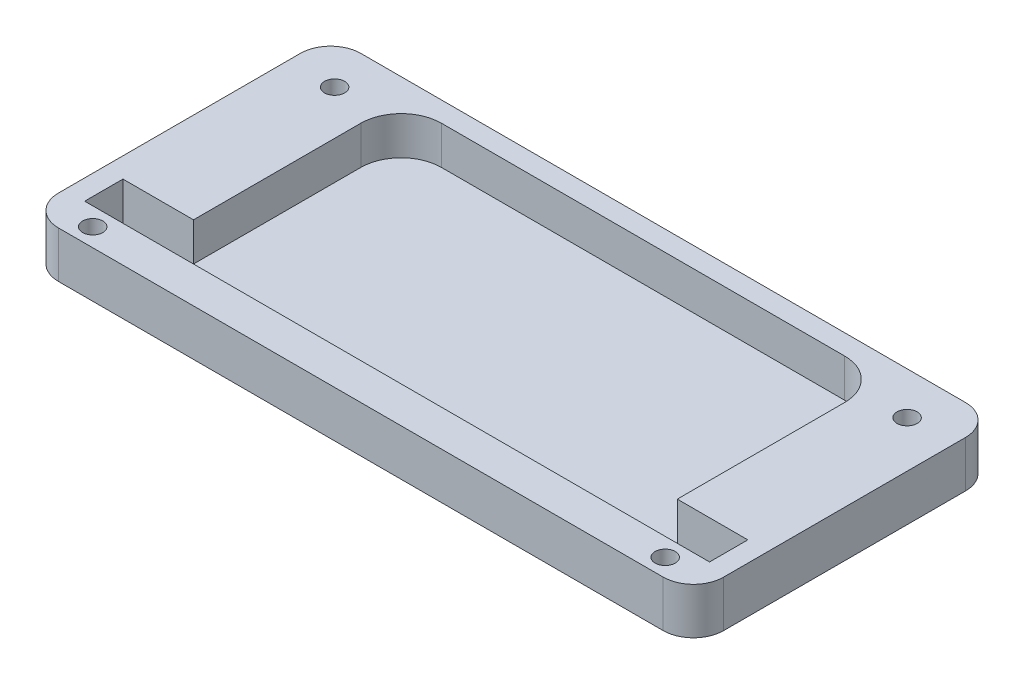
ISO-10303-21;
HEADER;
FILE_DESCRIPTION(('STEP AP214'),'2;1');
FILE_NAME('part.step','',(''),(''),'','','');
FILE_SCHEMA(('AUTOMOTIVE_DESIGN { 1 0 10303 214 1 1 1 1 }'));
ENDSEC;
DATA;
#1=APPLICATION_CONTEXT('core data for automotive mechanical design processes');
#2=APPLICATION_PROTOCOL_DEFINITION('international standard','automotive_design',2000,#1);
#3=PRODUCT_CONTEXT('',#1,'mechanical');
#4=PRODUCT('Part','Part','',(#3));
#5=PRODUCT_RELATED_PRODUCT_CATEGORY('part','',(#4));
#6=PRODUCT_DEFINITION_FORMATION('','',#4);
#7=PRODUCT_DEFINITION_CONTEXT('part definition',#1,'design');
#8=PRODUCT_DEFINITION('design','',#6,#7);
#9=PRODUCT_DEFINITION_SHAPE('','',#8);
#10=(LENGTH_UNIT() NAMED_UNIT(*) SI_UNIT(.MILLI.,.METRE.));
#11=(NAMED_UNIT(*) PLANE_ANGLE_UNIT() SI_UNIT($,.RADIAN.));
#12=(NAMED_UNIT(*) SI_UNIT($,.STERADIAN.) SOLID_ANGLE_UNIT());
#13=UNCERTAINTY_MEASURE_WITH_UNIT(LENGTH_MEASURE(1.E-05),#10,'distance_accuracy_value','');
#14=(GEOMETRIC_REPRESENTATION_CONTEXT(3) GLOBAL_UNCERTAINTY_ASSIGNED_CONTEXT((#13)) GLOBAL_UNIT_ASSIGNED_CONTEXT((#10,
#11,#12)) REPRESENTATION_CONTEXT('',''));
#15=CARTESIAN_POINT('',(0.,0.,0.));
#16=DIRECTION('',(0.,0.,1.));
#17=DIRECTION('',(1.,0.,0.));
#18=AXIS2_PLACEMENT_3D('',#15,#16,#17);
#19=CARTESIAN_POINT('',(0.,9.5,0.));
#20=DIRECTION('',(0.,-1.,0.));
#21=DIRECTION('',(0.,0.,-1.));
#22=AXIS2_PLACEMENT_3D('',#19,#20,#21);
#23=PLANE('',#22);
#24=DIRECTION('',(1.,0.,0.));
#25=VECTOR('',#24,1.);
#26=CARTESIAN_POINT('',(-82.5,9.5,13.75));
#27=LINE('',#26,#25);
#28=CARTESIAN_POINT('',(-75.,9.5,13.75));
#29=VERTEX_POINT('',#28);
#30=CARTESIAN_POINT('',(75.,9.5,13.75));
#31=VERTEX_POINT('',#30);
#32=EDGE_CURVE('E207',#29,#31,#27,.T.);
#33=ORIENTED_EDGE('',*,*,#32,.T.);
#34=CARTESIAN_POINT('',(75.,9.5,6.25000000000001));
#35=DIRECTION('',(0.,-1.,0.));
#36=DIRECTION('',(0.,0.,-1.));
#37=AXIS2_PLACEMENT_3D('',#34,#35,#36);
#38=CIRCLE('',#37,7.5);
#39=CARTESIAN_POINT('',(82.5,9.5,6.25000000000001));
#40=VERTEX_POINT('',#39);
#41=EDGE_CURVE('E255',#31,#40,#38,.F.);
#42=ORIENTED_EDGE('',*,*,#41,.T.);
#43=DIRECTION('',(0.,0.,-1.));
#44=VECTOR('',#43,1.);
#45=CARTESIAN_POINT('',(82.5,9.5,13.75));
#46=LINE('',#45,#44);
#47=CARTESIAN_POINT('',(82.5,9.5,-53.75));
#48=VERTEX_POINT('',#47);
#49=EDGE_CURVE('E211',#40,#48,#46,.T.);
#50=ORIENTED_EDGE('',*,*,#49,.T.);
#51=CARTESIAN_POINT('',(75.,9.5,-53.75));
#52=DIRECTION('',(0.,-1.,0.));
#53=DIRECTION('',(0.,0.,-1.));
#54=AXIS2_PLACEMENT_3D('',#51,#52,#53);
#55=CIRCLE('',#54,7.5);
#56=CARTESIAN_POINT('',(75.,9.5,-61.25));
#57=VERTEX_POINT('',#56);
#58=EDGE_CURVE('E60',#48,#57,#55,.F.);
#59=ORIENTED_EDGE('',*,*,#58,.T.);
#60=DIRECTION('',(-1.,0.,0.));
#61=VECTOR('',#60,1.);
#62=CARTESIAN_POINT('',(-82.5,9.5,-61.25));
#63=LINE('',#62,#61);
#64=CARTESIAN_POINT('',(-75.,9.5,-61.25));
#65=VERTEX_POINT('',#64);
#66=EDGE_CURVE('E213',#57,#65,#63,.T.);
#67=ORIENTED_EDGE('',*,*,#66,.T.);
#68=CARTESIAN_POINT('',(-75.,9.5,-53.75));
#69=DIRECTION('',(0.,-1.,0.));
#70=DIRECTION('',(0.,0.,-1.));
#71=AXIS2_PLACEMENT_3D('',#68,#69,#70);
#72=CIRCLE('',#71,7.5);
#73=CARTESIAN_POINT('',(-82.5,9.5,-53.75));
#74=VERTEX_POINT('',#73);
#75=EDGE_CURVE('E252',#65,#74,#72,.F.);
#76=ORIENTED_EDGE('',*,*,#75,.T.);
#77=DIRECTION('',(0.,0.,1.));
#78=VECTOR('',#77,1.);
#79=CARTESIAN_POINT('',(-82.5,9.5,13.75));
#80=LINE('',#79,#78);
#81=CARTESIAN_POINT('',(-82.5,9.5,6.25000000000001));
#82=VERTEX_POINT('',#81);
#83=EDGE_CURVE('E204',#74,#82,#80,.T.);
#84=ORIENTED_EDGE('',*,*,#83,.T.);
#85=CARTESIAN_POINT('',(-75.,9.5,6.25000000000001));
#86=DIRECTION('',(0.,-1.,0.));
#87=DIRECTION('',(0.,0.,-1.));
#88=AXIS2_PLACEMENT_3D('',#85,#86,#87);
#89=CIRCLE('',#88,7.5);
#90=EDGE_CURVE('E250',#82,#29,#89,.F.);
#91=ORIENTED_EDGE('',*,*,#90,.T.);
#92=EDGE_LOOP('',(#33,#42,#50,#59,#67,#76,#84,#91));
#93=FACE_BOUND('',#92,.T.);
#94=DIRECTION('',(0.,0.,1.));
#95=VECTOR('',#94,1.);
#96=CARTESIAN_POINT('',(-77.5,9.5,4.75000000000001));
#97=LINE('',#96,#95);
#98=CARTESIAN_POINT('',(-77.5,9.5,-4.74999999999999));
#99=VERTEX_POINT('',#98);
#100=CARTESIAN_POINT('',(-77.5,9.5,4.75000000000001));
#101=VERTEX_POINT('',#100);
#102=EDGE_CURVE('E186',#99,#101,#97,.T.);
#103=ORIENTED_EDGE('',*,*,#102,.F.);
#104=DIRECTION('',(-1.,0.,0.));
#105=VECTOR('',#104,1.);
#106=CARTESIAN_POINT('',(-77.5,9.5,-4.74999999999999));
#107=LINE('',#106,#105);
#108=CARTESIAN_POINT('',(-60.,9.5,-4.74999999999999));
#109=VERTEX_POINT('',#108);
#110=EDGE_CURVE('E195',#109,#99,#107,.T.);
#111=ORIENTED_EDGE('',*,*,#110,.F.);
#112=DIRECTION('',(0.,0.,1.));
#113=VECTOR('',#112,1.);
#114=CARTESIAN_POINT('',(-60.,9.5,-4.74999999999999));
#115=LINE('',#114,#113);
#116=CARTESIAN_POINT('',(-60.,9.5,-46.25));
#117=VERTEX_POINT('',#116);
#118=EDGE_CURVE('E190',#117,#109,#115,.T.);
#119=ORIENTED_EDGE('',*,*,#118,.F.);
#120=CARTESIAN_POINT('',(-50.,9.5,-46.25));
#121=DIRECTION('',(0.,-1.,0.));
#122=DIRECTION('',(0.,0.,-1.));
#123=AXIS2_PLACEMENT_3D('',#120,#121,#122);
#124=CIRCLE('',#123,10.);
#125=CARTESIAN_POINT('',(-50.,9.5,-56.25));
#126=VERTEX_POINT('',#125);
#127=EDGE_CURVE('E230',#117,#126,#124,.T.);
#128=ORIENTED_EDGE('',*,*,#127,.T.);
#129=DIRECTION('',(-1.,0.,0.));
#130=VECTOR('',#129,1.);
#131=CARTESIAN_POINT('',(-60.,9.5,-56.25));
#132=LINE('',#131,#130);
#133=CARTESIAN_POINT('',(50.,9.5,-56.25));
#134=VERTEX_POINT('',#133);
#135=EDGE_CURVE('E326',#134,#126,#132,.T.);
#136=ORIENTED_EDGE('',*,*,#135,.F.);
#137=CARTESIAN_POINT('',(50.,9.5,-46.25));
#138=DIRECTION('',(0.,-1.,0.));
#139=DIRECTION('',(0.,0.,-1.));
#140=AXIS2_PLACEMENT_3D('',#137,#138,#139);
#141=CIRCLE('',#140,10.);
#142=CARTESIAN_POINT('',(60.,9.5,-46.25));
#143=VERTEX_POINT('',#142);
#144=EDGE_CURVE('E228',#134,#143,#141,.T.);
#145=ORIENTED_EDGE('',*,*,#144,.T.);
#146=DIRECTION('',(0.,0.,-1.));
#147=VECTOR('',#146,1.);
#148=CARTESIAN_POINT('',(60.,9.5,-4.74999999999999));
#149=LINE('',#148,#147);
#150=CARTESIAN_POINT('',(60.,9.5,-4.74999999999999));
#151=VERTEX_POINT('',#150);
#152=EDGE_CURVE('E323',#151,#143,#149,.T.);
#153=ORIENTED_EDGE('',*,*,#152,.F.);
#154=DIRECTION('',(-1.,0.,0.));
#155=VECTOR('',#154,1.);
#156=CARTESIAN_POINT('',(77.5,9.5,-4.74999999999999));
#157=LINE('',#156,#155);
#158=CARTESIAN_POINT('',(77.5,9.5,-4.74999999999999));
#159=VERTEX_POINT('',#158);
#160=EDGE_CURVE('E321',#159,#151,#157,.T.);
#161=ORIENTED_EDGE('',*,*,#160,.F.);
#162=DIRECTION('',(0.,0.,-1.));
#163=VECTOR('',#162,1.);
#164=CARTESIAN_POINT('',(77.5,9.5,4.74999999999997));
#165=LINE('',#164,#163);
#166=CARTESIAN_POINT('',(77.5,9.5,4.74999999999997));
#167=VERTEX_POINT('',#166);
#168=EDGE_CURVE('E319',#167,#159,#165,.T.);
#169=ORIENTED_EDGE('',*,*,#168,.F.);
#170=DIRECTION('',(1.,0.,0.));
#171=VECTOR('',#170,1.);
#172=CARTESIAN_POINT('',(77.5,9.5,4.74999999999997));
#173=LINE('',#172,#171);
#174=EDGE_CURVE('E316',#101,#167,#173,.T.);
#175=ORIENTED_EDGE('',*,*,#174,.F.);
#176=EDGE_LOOP('',(#103,#111,#119,#128,#136,#145,#153,#161,#169,#175));
#177=FACE_BOUND('',#176,.T.);
#178=CARTESIAN_POINT('',(-71.,9.5,-50.75));
#179=DIRECTION('',(0.,1.,0.));
#180=DIRECTION('',(0.,0.,1.));
#181=AXIS2_PLACEMENT_3D('',#178,#179,#180);
#182=CIRCLE('',#181,2.50000000000001);
#183=CARTESIAN_POINT('',(-71.,9.5,-48.25));
#184=VERTEX_POINT('',#183);
#185=EDGE_CURVE('E311',#184,#184,#182,.T.);
#186=ORIENTED_EDGE('',*,*,#185,.F.);
#187=EDGE_LOOP('',(#186));
#188=FACE_BOUND('',#187,.T.);
#189=CARTESIAN_POINT('',(-71.,9.5,9.25000000000001));
#190=DIRECTION('',(0.,1.,0.));
#191=DIRECTION('',(0.,0.,1.));
#192=AXIS2_PLACEMENT_3D('',#189,#190,#191);
#193=CIRCLE('',#192,2.49999999999999);
#194=CARTESIAN_POINT('',(-71.,9.5,11.75));
#195=VERTEX_POINT('',#194);
#196=EDGE_CURVE('E308',#195,#195,#193,.T.);
#197=ORIENTED_EDGE('',*,*,#196,.F.);
#198=EDGE_LOOP('',(#197));
#199=FACE_BOUND('',#198,.T.);
#200=CARTESIAN_POINT('',(71.,9.5,9.25000000000001));
#201=DIRECTION('',(0.,1.,0.));
#202=DIRECTION('',(0.,0.,-1.));
#203=AXIS2_PLACEMENT_3D('',#200,#201,#202);
#204=CIRCLE('',#203,2.49999999999999);
#205=CARTESIAN_POINT('',(71.,9.5,6.75000000000002));
#206=VERTEX_POINT('',#205);
#207=EDGE_CURVE('E305',#206,#206,#204,.T.);
#208=ORIENTED_EDGE('',*,*,#207,.F.);
#209=EDGE_LOOP('',(#208));
#210=FACE_BOUND('',#209,.T.);
#211=CARTESIAN_POINT('',(71.,9.5,-50.75));
#212=DIRECTION('',(0.,1.,0.));
#213=DIRECTION('',(0.,0.,-1.));
#214=AXIS2_PLACEMENT_3D('',#211,#212,#213);
#215=CIRCLE('',#214,2.50000000000001);
#216=CARTESIAN_POINT('',(71.,9.5,-53.25));
#217=VERTEX_POINT('',#216);
#218=EDGE_CURVE('E302',#217,#217,#215,.T.);
#219=ORIENTED_EDGE('',*,*,#218,.F.);
#220=EDGE_LOOP('',(#219));
#221=FACE_BOUND('',#220,.T.);
#222=ADVANCED_FACE('F38',(#93,#177,#188,#199,#210,#221),#23,.F.);
#223=CARTESIAN_POINT('',(-82.5,9.5,13.75));
#224=DIRECTION('',(1.,0.,0.));
#225=DIRECTION('',(0.,0.,-1.));
#226=AXIS2_PLACEMENT_3D('',#223,#224,#225);
#227=PLANE('',#226);
#228=ORIENTED_EDGE('',*,*,#83,.F.);
#229=DIRECTION('',(0.,-1.,0.));
#230=VECTOR('',#229,1.);
#231=CARTESIAN_POINT('',(-82.5,9.5,-53.75));
#232=LINE('',#231,#230);
#233=CARTESIAN_POINT('',(-82.5,-2.,-53.75));
#234=VERTEX_POINT('',#233);
#235=EDGE_CURVE('E11',#74,#234,#232,.T.);
#236=ORIENTED_EDGE('',*,*,#235,.T.);
#237=DIRECTION('',(0.,0.,-1.));
#238=VECTOR('',#237,1.);
#239=CARTESIAN_POINT('',(-82.5,-2.,0.));
#240=LINE('',#239,#238);
#241=CARTESIAN_POINT('',(-82.5,-2.,6.25000000000001));
#242=VERTEX_POINT('',#241);
#243=EDGE_CURVE('E267',#242,#234,#240,.T.);
#244=ORIENTED_EDGE('',*,*,#243,.F.);
#245=DIRECTION('',(0.,-1.,0.));
#246=VECTOR('',#245,1.);
#247=CARTESIAN_POINT('',(-82.5,9.5,6.25000000000001));
#248=LINE('',#247,#246);
#249=EDGE_CURVE('E46',#242,#82,#248,.F.);
#250=ORIENTED_EDGE('',*,*,#249,.T.);
#251=EDGE_LOOP('',(#228,#236,#244,#250));
#252=FACE_BOUND('',#251,.T.);
#253=ADVANCED_FACE('F264',(#252),#227,.F.);
#254=CARTESIAN_POINT('',(-82.5,9.5,13.75));
#255=DIRECTION('',(0.,0.,-1.));
#256=DIRECTION('',(-1.,0.,0.));
#257=AXIS2_PLACEMENT_3D('',#254,#255,#256);
#258=PLANE('',#257);
#259=DIRECTION('',(1.,0.,0.));
#260=VECTOR('',#259,1.);
#261=CARTESIAN_POINT('',(0.,-2.,13.75));
#262=LINE('',#261,#260);
#263=CARTESIAN_POINT('',(-75.,-2.,13.75));
#264=VERTEX_POINT('',#263);
#265=CARTESIAN_POINT('',(75.,-2.,13.75));
#266=VERTEX_POINT('',#265);
#267=EDGE_CURVE('E278',#264,#266,#262,.T.);
#268=ORIENTED_EDGE('',*,*,#267,.T.);
#269=DIRECTION('',(0.,-1.,0.));
#270=VECTOR('',#269,1.);
#271=CARTESIAN_POINT('',(75.,9.5,13.75));
#272=LINE('',#271,#270);
#273=EDGE_CURVE('E248',#266,#31,#272,.F.);
#274=ORIENTED_EDGE('',*,*,#273,.T.);
#275=ORIENTED_EDGE('',*,*,#32,.F.);
#276=DIRECTION('',(0.,-1.,0.));
#277=VECTOR('',#276,1.);
#278=CARTESIAN_POINT('',(-75.,9.5,13.75));
#279=LINE('',#278,#277);
#280=EDGE_CURVE('E245',#29,#264,#279,.T.);
#281=ORIENTED_EDGE('',*,*,#280,.T.);
#282=EDGE_LOOP('',(#268,#274,#275,#281));
#283=FACE_BOUND('',#282,.T.);
#284=ADVANCED_FACE('F277',(#283),#258,.F.);
#285=CARTESIAN_POINT('',(82.5,9.5,13.75));
#286=DIRECTION('',(-1.,0.,0.));
#287=DIRECTION('',(0.,0.,1.));
#288=AXIS2_PLACEMENT_3D('',#285,#286,#287);
#289=PLANE('',#288);
#290=ORIENTED_EDGE('',*,*,#49,.F.);
#291=DIRECTION('',(0.,-1.,0.));
#292=VECTOR('',#291,1.);
#293=CARTESIAN_POINT('',(82.5,9.5,6.25000000000001));
#294=LINE('',#293,#292);
#295=CARTESIAN_POINT('',(82.5,-2.,6.25000000000001));
#296=VERTEX_POINT('',#295);
#297=EDGE_CURVE('E234',#40,#296,#294,.T.);
#298=ORIENTED_EDGE('',*,*,#297,.T.);
#299=DIRECTION('',(0.,0.,-1.));
#300=VECTOR('',#299,1.);
#301=CARTESIAN_POINT('',(82.5,-2.,0.));
#302=LINE('',#301,#300);
#303=CARTESIAN_POINT('',(82.5,-2.,-53.75));
#304=VERTEX_POINT('',#303);
#305=EDGE_CURVE('E285',#296,#304,#302,.T.);
#306=ORIENTED_EDGE('',*,*,#305,.T.);
#307=DIRECTION('',(0.,-1.,0.));
#308=VECTOR('',#307,1.);
#309=CARTESIAN_POINT('',(82.5,9.5,-53.75));
#310=LINE('',#309,#308);
#311=EDGE_CURVE('E232',#304,#48,#310,.F.);
#312=ORIENTED_EDGE('',*,*,#311,.T.);
#313=EDGE_LOOP('',(#290,#298,#306,#312));
#314=FACE_BOUND('',#313,.T.);
#315=ADVANCED_FACE('F403',(#314),#289,.F.);
#316=CARTESIAN_POINT('',(-82.5,9.5,-61.25));
#317=DIRECTION('',(0.,0.,1.));
#318=DIRECTION('',(1.,0.,0.));
#319=AXIS2_PLACEMENT_3D('',#316,#317,#318);
#320=PLANE('',#319);
#321=ORIENTED_EDGE('',*,*,#66,.F.);
#322=DIRECTION('',(0.,-1.,0.));
#323=VECTOR('',#322,1.);
#324=CARTESIAN_POINT('',(75.,9.5,-61.25));
#325=LINE('',#324,#323);
#326=CARTESIAN_POINT('',(75.,-2.,-61.25));
#327=VERTEX_POINT('',#326);
#328=EDGE_CURVE('E258',#57,#327,#325,.T.);
#329=ORIENTED_EDGE('',*,*,#328,.T.);
#330=DIRECTION('',(1.,0.,0.));
#331=VECTOR('',#330,1.);
#332=CARTESIAN_POINT('',(0.,-2.,-61.25));
#333=LINE('',#332,#331);
#334=CARTESIAN_POINT('',(-75.,-2.,-61.25));
#335=VERTEX_POINT('',#334);
#336=EDGE_CURVE('E289',#335,#327,#333,.T.);
#337=ORIENTED_EDGE('',*,*,#336,.F.);
#338=DIRECTION('',(0.,-1.,0.));
#339=VECTOR('',#338,1.);
#340=CARTESIAN_POINT('',(-75.,9.5,-61.25));
#341=LINE('',#340,#339);
#342=EDGE_CURVE('E53',#335,#65,#341,.F.);
#343=ORIENTED_EDGE('',*,*,#342,.T.);
#344=EDGE_LOOP('',(#321,#329,#337,#343));
#345=FACE_BOUND('',#344,.T.);
#346=ADVANCED_FACE('F400',(#345),#320,.F.);
#347=CARTESIAN_POINT('',(-77.5,9.5,4.75000000000001));
#348=DIRECTION('',(1.,0.,0.));
#349=DIRECTION('',(0.,0.,-1.));
#350=AXIS2_PLACEMENT_3D('',#347,#348,#349);
#351=PLANE('',#350);
#352=DIRECTION('',(0.,0.,1.));
#353=VECTOR('',#352,1.);
#354=CARTESIAN_POINT('',(-77.5,0.,4.75000000000001));
#355=LINE('',#354,#353);
#356=CARTESIAN_POINT('',(-77.5,0.,-4.74999999999999));
#357=VERTEX_POINT('',#356);
#358=CARTESIAN_POINT('',(-77.5,0.,4.75000000000001));
#359=VERTEX_POINT('',#358);
#360=EDGE_CURVE('E314',#357,#359,#355,.T.);
#361=ORIENTED_EDGE('',*,*,#360,.F.);
#362=DIRECTION('',(0.,-1.,0.));
#363=VECTOR('',#362,1.);
#364=CARTESIAN_POINT('',(-77.5,9.5,-4.74999999999999));
#365=LINE('',#364,#363);
#366=EDGE_CURVE('E185',#99,#357,#365,.T.);
#367=ORIENTED_EDGE('',*,*,#366,.F.);
#368=ORIENTED_EDGE('',*,*,#102,.T.);
#369=DIRECTION('',(0.,-1.,0.));
#370=VECTOR('',#369,1.);
#371=CARTESIAN_POINT('',(-77.5,9.5,4.75000000000001));
#372=LINE('',#371,#370);
#373=EDGE_CURVE('E201',#101,#359,#372,.T.);
#374=ORIENTED_EDGE('',*,*,#373,.T.);
#375=EDGE_LOOP('',(#361,#367,#368,#374));
#376=FACE_BOUND('',#375,.T.);
#377=ADVANCED_FACE('F376',(#376),#351,.T.);
#378=CARTESIAN_POINT('',(77.5,9.5,4.74999999999997));
#379=DIRECTION('',(0.,0.,-1.));
#380=DIRECTION('',(-1.,0.,0.));
#381=AXIS2_PLACEMENT_3D('',#378,#379,#380);
#382=PLANE('',#381);
#383=DIRECTION('',(1.,0.,0.));
#384=VECTOR('',#383,1.);
#385=CARTESIAN_POINT('',(77.5,0.,4.74999999999997));
#386=LINE('',#385,#384);
#387=CARTESIAN_POINT('',(77.5,0.,4.74999999999997));
#388=VERTEX_POINT('',#387);
#389=EDGE_CURVE('E332',#359,#388,#386,.T.);
#390=ORIENTED_EDGE('',*,*,#389,.F.);
#391=ORIENTED_EDGE('',*,*,#373,.F.);
#392=ORIENTED_EDGE('',*,*,#174,.T.);
#393=DIRECTION('',(0.,-1.,0.));
#394=VECTOR('',#393,1.);
#395=CARTESIAN_POINT('',(77.5,9.5,4.74999999999997));
#396=LINE('',#395,#394);
#397=EDGE_CURVE('E199',#167,#388,#396,.T.);
#398=ORIENTED_EDGE('',*,*,#397,.T.);
#399=EDGE_LOOP('',(#390,#391,#392,#398));
#400=FACE_BOUND('',#399,.T.);
#401=ADVANCED_FACE('F373',(#400),#382,.T.);
#402=CARTESIAN_POINT('',(77.5,9.5,4.74999999999997));
#403=DIRECTION('',(-1.,0.,0.));
#404=DIRECTION('',(0.,0.,1.));
#405=AXIS2_PLACEMENT_3D('',#402,#403,#404);
#406=PLANE('',#405);
#407=DIRECTION('',(0.,0.,-1.));
#408=VECTOR('',#407,1.);
#409=CARTESIAN_POINT('',(77.5,0.,4.74999999999997));
#410=LINE('',#409,#408);
#411=CARTESIAN_POINT('',(77.5,0.,-4.74999999999999));
#412=VERTEX_POINT('',#411);
#413=EDGE_CURVE('E336',#388,#412,#410,.T.);
#414=ORIENTED_EDGE('',*,*,#413,.F.);
#415=ORIENTED_EDGE('',*,*,#397,.F.);
#416=ORIENTED_EDGE('',*,*,#168,.T.);
#417=DIRECTION('',(0.,-1.,0.));
#418=VECTOR('',#417,1.);
#419=CARTESIAN_POINT('',(77.5,9.5,-4.74999999999999));
#420=LINE('',#419,#418);
#421=EDGE_CURVE('E193',#159,#412,#420,.T.);
#422=ORIENTED_EDGE('',*,*,#421,.T.);
#423=EDGE_LOOP('',(#414,#415,#416,#422));
#424=FACE_BOUND('',#423,.T.);
#425=ADVANCED_FACE('F371',(#424),#406,.T.);
#426=CARTESIAN_POINT('',(77.5,9.5,-4.74999999999999));
#427=DIRECTION('',(0.,0.,1.));
#428=DIRECTION('',(1.,0.,0.));
#429=AXIS2_PLACEMENT_3D('',#426,#427,#428);
#430=PLANE('',#429);
#431=DIRECTION('',(-1.,0.,0.));
#432=VECTOR('',#431,1.);
#433=CARTESIAN_POINT('',(77.5,0.,-4.74999999999999));
#434=LINE('',#433,#432);
#435=CARTESIAN_POINT('',(60.,0.,-4.74999999999999));
#436=VERTEX_POINT('',#435);
#437=EDGE_CURVE('E339',#412,#436,#434,.T.);
#438=ORIENTED_EDGE('',*,*,#437,.F.);
#439=ORIENTED_EDGE('',*,*,#421,.F.);
#440=ORIENTED_EDGE('',*,*,#160,.T.);
#441=DIRECTION('',(0.,-1.,0.));
#442=VECTOR('',#441,1.);
#443=CARTESIAN_POINT('',(60.,9.5,-4.74999999999999));
#444=LINE('',#443,#442);
#445=EDGE_CURVE('E191',#151,#436,#444,.T.);
#446=ORIENTED_EDGE('',*,*,#445,.T.);
#447=EDGE_LOOP('',(#438,#439,#440,#446));
#448=FACE_BOUND('',#447,.T.);
#449=ADVANCED_FACE('F364',(#448),#430,.T.);
#450=CARTESIAN_POINT('',(60.,9.5,-4.74999999999999));
#451=DIRECTION('',(-1.,0.,0.));
#452=DIRECTION('',(0.,0.,1.));
#453=AXIS2_PLACEMENT_3D('',#450,#451,#452);
#454=PLANE('',#453);
#455=ORIENTED_EDGE('',*,*,#152,.T.);
#456=DIRECTION('',(0.,-1.,0.));
#457=VECTOR('',#456,1.);
#458=CARTESIAN_POINT('',(60.,0.,-46.25));
#459=LINE('',#458,#457);
#460=CARTESIAN_POINT('',(60.,0.,-46.25));
#461=VERTEX_POINT('',#460);
#462=EDGE_CURVE('E215',#143,#461,#459,.T.);
#463=ORIENTED_EDGE('',*,*,#462,.T.);
#464=DIRECTION('',(0.,0.,-1.));
#465=VECTOR('',#464,1.);
#466=CARTESIAN_POINT('',(60.,0.,-4.74999999999999));
#467=LINE('',#466,#465);
#468=EDGE_CURVE('E342',#436,#461,#467,.T.);
#469=ORIENTED_EDGE('',*,*,#468,.F.);
#470=ORIENTED_EDGE('',*,*,#445,.F.);
#471=EDGE_LOOP('',(#455,#463,#469,#470));
#472=FACE_BOUND('',#471,.T.);
#473=ADVANCED_FACE('F360',(#472),#454,.T.);
#474=CARTESIAN_POINT('',(-60.,9.5,-56.25));
#475=DIRECTION('',(0.,0.,1.));
#476=DIRECTION('',(1.,0.,0.));
#477=AXIS2_PLACEMENT_3D('',#474,#475,#476);
#478=PLANE('',#477);
#479=DIRECTION('',(-1.,0.,0.));
#480=VECTOR('',#479,1.);
#481=CARTESIAN_POINT('',(-60.,0.,-56.25));
#482=LINE('',#481,#480);
#483=CARTESIAN_POINT('',(50.,0.,-56.25));
#484=VERTEX_POINT('',#483);
#485=CARTESIAN_POINT('',(-50.,0.,-56.25));
#486=VERTEX_POINT('',#485);
#487=EDGE_CURVE('E176',#484,#486,#482,.T.);
#488=ORIENTED_EDGE('',*,*,#487,.F.);
#489=DIRECTION('',(0.,-1.,0.));
#490=VECTOR('',#489,1.);
#491=CARTESIAN_POINT('',(50.,9.5,-56.25));
#492=LINE('',#491,#490);
#493=EDGE_CURVE('E224',#484,#134,#492,.F.);
#494=ORIENTED_EDGE('',*,*,#493,.T.);
#495=ORIENTED_EDGE('',*,*,#135,.T.);
#496=DIRECTION('',(0.,-1.,0.));
#497=VECTOR('',#496,1.);
#498=CARTESIAN_POINT('',(-50.,0.,-56.25));
#499=LINE('',#498,#497);
#500=EDGE_CURVE('E221',#126,#486,#499,.T.);
#501=ORIENTED_EDGE('',*,*,#500,.T.);
#502=EDGE_LOOP('',(#488,#494,#495,#501));
#503=FACE_BOUND('',#502,.T.);
#504=ADVANCED_FACE('F347',(#503),#478,.T.);
#505=CARTESIAN_POINT('',(-60.,9.5,-4.74999999999999));
#506=DIRECTION('',(1.,0.,0.));
#507=DIRECTION('',(0.,0.,-1.));
#508=AXIS2_PLACEMENT_3D('',#505,#506,#507);
#509=PLANE('',#508);
#510=DIRECTION('',(0.,0.,1.));
#511=VECTOR('',#510,1.);
#512=CARTESIAN_POINT('',(-60.,0.,-4.74999999999999));
#513=LINE('',#512,#511);
#514=CARTESIAN_POINT('',(-60.,0.,-46.25));
#515=VERTEX_POINT('',#514);
#516=CARTESIAN_POINT('',(-60.,0.,-4.74999999999999));
#517=VERTEX_POINT('',#516);
#518=EDGE_CURVE('E165',#515,#517,#513,.T.);
#519=ORIENTED_EDGE('',*,*,#518,.F.);
#520=DIRECTION('',(0.,-1.,0.));
#521=VECTOR('',#520,1.);
#522=CARTESIAN_POINT('',(-60.,9.5,-46.25));
#523=LINE('',#522,#521);
#524=EDGE_CURVE('E226',#515,#117,#523,.F.);
#525=ORIENTED_EDGE('',*,*,#524,.T.);
#526=ORIENTED_EDGE('',*,*,#118,.T.);
#527=DIRECTION('',(0.,-1.,0.));
#528=VECTOR('',#527,1.);
#529=CARTESIAN_POINT('',(-60.,9.5,-4.74999999999999));
#530=LINE('',#529,#528);
#531=EDGE_CURVE('E182',#109,#517,#530,.T.);
#532=ORIENTED_EDGE('',*,*,#531,.T.);
#533=EDGE_LOOP('',(#519,#525,#526,#532));
#534=FACE_BOUND('',#533,.T.);
#535=ADVANCED_FACE('F188',(#534),#509,.T.);
#536=CARTESIAN_POINT('',(-77.5,9.5,-4.74999999999999));
#537=DIRECTION('',(0.,0.,1.));
#538=DIRECTION('',(1.,0.,0.));
#539=AXIS2_PLACEMENT_3D('',#536,#537,#538);
#540=PLANE('',#539);
#541=DIRECTION('',(-1.,0.,0.));
#542=VECTOR('',#541,1.);
#543=CARTESIAN_POINT('',(-77.5,0.,-4.74999999999999));
#544=LINE('',#543,#542);
#545=EDGE_CURVE('E170',#517,#357,#544,.T.);
#546=ORIENTED_EDGE('',*,*,#545,.F.);
#547=ORIENTED_EDGE('',*,*,#531,.F.);
#548=ORIENTED_EDGE('',*,*,#110,.T.);
#549=ORIENTED_EDGE('',*,*,#366,.T.);
#550=EDGE_LOOP('',(#546,#547,#548,#549));
#551=FACE_BOUND('',#550,.T.);
#552=ADVANCED_FACE('F181',(#551),#540,.T.);
#553=CARTESIAN_POINT('',(-71.,9.5,-50.75));
#554=DIRECTION('',(0.,-1.,0.));
#555=DIRECTION('',(0.,0.,-1.));
#556=AXIS2_PLACEMENT_3D('',#553,#554,#555);
#557=CYLINDRICAL_SURFACE('',#556,2.50000000000001);
#558=ORIENTED_EDGE('',*,*,#185,.T.);
#559=EDGE_LOOP('',(#558));
#560=FACE_BOUND('',#559,.T.);
#561=CARTESIAN_POINT('',(-71.,-2.,-50.75));
#562=DIRECTION('',(0.,1.,0.));
#563=DIRECTION('',(0.,0.,1.));
#564=AXIS2_PLACEMENT_3D('',#561,#562,#563);
#565=CIRCLE('',#564,2.50000000000001);
#566=CARTESIAN_POINT('',(-71.,-2.,-48.25));
#567=VERTEX_POINT('',#566);
#568=EDGE_CURVE('E292',#567,#567,#565,.T.);
#569=ORIENTED_EDGE('',*,*,#568,.F.);
#570=EDGE_LOOP('',(#569));
#571=FACE_BOUND('',#570,.T.);
#572=ADVANCED_FACE('F469',(#560,#571),#557,.F.);
#573=CARTESIAN_POINT('',(-71.,9.5,9.25000000000001));
#574=DIRECTION('',(0.,-1.,0.));
#575=DIRECTION('',(0.,0.,-1.));
#576=AXIS2_PLACEMENT_3D('',#573,#574,#575);
#577=CYLINDRICAL_SURFACE('',#576,2.49999999999999);
#578=ORIENTED_EDGE('',*,*,#196,.T.);
#579=EDGE_LOOP('',(#578));
#580=FACE_BOUND('',#579,.T.);
#581=CARTESIAN_POINT('',(-71.,-2.,9.25000000000001));
#582=DIRECTION('',(0.,1.,0.));
#583=DIRECTION('',(0.,0.,1.));
#584=AXIS2_PLACEMENT_3D('',#581,#582,#583);
#585=CIRCLE('',#584,2.49999999999999);
#586=CARTESIAN_POINT('',(-71.,-2.,11.75));
#587=VERTEX_POINT('',#586);
#588=EDGE_CURVE('E286',#587,#587,#585,.T.);
#589=ORIENTED_EDGE('',*,*,#588,.F.);
#590=EDGE_LOOP('',(#589));
#591=FACE_BOUND('',#590,.T.);
#592=ADVANCED_FACE('F476',(#580,#591),#577,.F.);
#593=CARTESIAN_POINT('',(71.,9.5,9.25000000000001));
#594=DIRECTION('',(0.,-1.,0.));
#595=DIRECTION('',(0.,0.,-1.));
#596=AXIS2_PLACEMENT_3D('',#593,#594,#595);
#597=CYLINDRICAL_SURFACE('',#596,2.49999999999999);
#598=ORIENTED_EDGE('',*,*,#207,.T.);
#599=EDGE_LOOP('',(#598));
#600=FACE_BOUND('',#599,.T.);
#601=CARTESIAN_POINT('',(71.,-2.,9.25000000000001));
#602=DIRECTION('',(0.,1.,0.));
#603=DIRECTION('',(0.,0.,1.));
#604=AXIS2_PLACEMENT_3D('',#601,#602,#603);
#605=CIRCLE('',#604,2.49999999999999);
#606=CARTESIAN_POINT('',(71.,-2.,11.75));
#607=VERTEX_POINT('',#606);
#608=EDGE_CURVE('E632',#607,#607,#605,.F.);
#609=ORIENTED_EDGE('',*,*,#608,.T.);
#610=EDGE_LOOP('',(#609));
#611=FACE_BOUND('',#610,.T.);
#612=ADVANCED_FACE('F484',(#600,#611),#597,.F.);
#613=CARTESIAN_POINT('',(71.,9.5,-50.75));
#614=DIRECTION('',(0.,-1.,0.));
#615=DIRECTION('',(0.,0.,-1.));
#616=AXIS2_PLACEMENT_3D('',#613,#614,#615);
#617=CYLINDRICAL_SURFACE('',#616,2.50000000000001);
#618=ORIENTED_EDGE('',*,*,#218,.T.);
#619=EDGE_LOOP('',(#618));
#620=FACE_BOUND('',#619,.T.);
#621=CARTESIAN_POINT('',(71.,-2.,-50.75));
#622=DIRECTION('',(0.,1.,0.));
#623=DIRECTION('',(0.,0.,1.));
#624=AXIS2_PLACEMENT_3D('',#621,#622,#623);
#625=CIRCLE('',#624,2.50000000000001);
#626=CARTESIAN_POINT('',(71.,-2.,-48.25));
#627=VERTEX_POINT('',#626);
#628=EDGE_CURVE('E299',#627,#627,#625,.F.);
#629=ORIENTED_EDGE('',*,*,#628,.T.);
#630=EDGE_LOOP('',(#629));
#631=FACE_BOUND('',#630,.T.);
#632=ADVANCED_FACE('F492',(#620,#631),#617,.F.);
#633=CARTESIAN_POINT('',(0.,0.,0.));
#634=DIRECTION('',(0.,1.,0.));
#635=DIRECTION('',(0.,0.,1.));
#636=AXIS2_PLACEMENT_3D('',#633,#634,#635);
#637=PLANE('',#636);
#638=ORIENTED_EDGE('',*,*,#468,.T.);
#639=CARTESIAN_POINT('',(50.,0.,-46.25));
#640=DIRECTION('',(0.,1.,0.));
#641=DIRECTION('',(0.,0.,1.));
#642=AXIS2_PLACEMENT_3D('',#639,#640,#641);
#643=CIRCLE('',#642,10.);
#644=EDGE_CURVE('E219',#461,#484,#643,.T.);
#645=ORIENTED_EDGE('',*,*,#644,.T.);
#646=ORIENTED_EDGE('',*,*,#487,.T.);
#647=CARTESIAN_POINT('',(-50.,0.,-46.25));
#648=DIRECTION('',(0.,1.,0.));
#649=DIRECTION('',(0.,0.,1.));
#650=AXIS2_PLACEMENT_3D('',#647,#648,#649);
#651=CIRCLE('',#650,10.);
#652=EDGE_CURVE('E172',#486,#515,#651,.T.);
#653=ORIENTED_EDGE('',*,*,#652,.T.);
#654=ORIENTED_EDGE('',*,*,#518,.T.);
#655=ORIENTED_EDGE('',*,*,#545,.T.);
#656=ORIENTED_EDGE('',*,*,#360,.T.);
#657=ORIENTED_EDGE('',*,*,#389,.T.);
#658=ORIENTED_EDGE('',*,*,#413,.T.);
#659=ORIENTED_EDGE('',*,*,#437,.T.);
#660=EDGE_LOOP('',(#638,#645,#646,#653,#654,#655,#656,#657,#658,#659));
#661=FACE_BOUND('',#660,.T.);
#662=ADVANCED_FACE('F168',(#661),#637,.T.);
#663=CARTESIAN_POINT('',(0.,-2.,0.));
#664=DIRECTION('',(0.,1.,0.));
#665=DIRECTION('',(0.,0.,1.));
#666=AXIS2_PLACEMENT_3D('',#663,#664,#665);
#667=PLANE('',#666);
#668=ORIENTED_EDGE('',*,*,#608,.F.);
#669=EDGE_LOOP('',(#668));
#670=FACE_BOUND('',#669,.T.);
#671=ORIENTED_EDGE('',*,*,#568,.T.);
#672=EDGE_LOOP('',(#671));
#673=FACE_BOUND('',#672,.T.);
#674=ORIENTED_EDGE('',*,*,#588,.T.);
#675=EDGE_LOOP('',(#674));
#676=FACE_BOUND('',#675,.T.);
#677=ORIENTED_EDGE('',*,*,#305,.F.);
#678=CARTESIAN_POINT('',(75.,-2.,6.25000000000001));
#679=DIRECTION('',(0.,1.,0.));
#680=DIRECTION('',(0.,0.,1.));
#681=AXIS2_PLACEMENT_3D('',#678,#679,#680);
#682=CIRCLE('',#681,7.5);
#683=EDGE_CURVE('E243',#296,#266,#682,.F.);
#684=ORIENTED_EDGE('',*,*,#683,.T.);
#685=ORIENTED_EDGE('',*,*,#267,.F.);
#686=CARTESIAN_POINT('',(-75.,-2.,6.25000000000001));
#687=DIRECTION('',(0.,1.,0.));
#688=DIRECTION('',(0.,0.,1.));
#689=AXIS2_PLACEMENT_3D('',#686,#687,#688);
#690=CIRCLE('',#689,7.5);
#691=EDGE_CURVE('E237',#264,#242,#690,.F.);
#692=ORIENTED_EDGE('',*,*,#691,.T.);
#693=ORIENTED_EDGE('',*,*,#243,.T.);
#694=CARTESIAN_POINT('',(-75.,-2.,-53.75));
#695=DIRECTION('',(0.,1.,0.));
#696=DIRECTION('',(0.,0.,1.));
#697=AXIS2_PLACEMENT_3D('',#694,#695,#696);
#698=CIRCLE('',#697,7.5);
#699=EDGE_CURVE('E239',#234,#335,#698,.F.);
#700=ORIENTED_EDGE('',*,*,#699,.T.);
#701=ORIENTED_EDGE('',*,*,#336,.T.);
#702=CARTESIAN_POINT('',(75.,-2.,-53.75));
#703=DIRECTION('',(0.,1.,0.));
#704=DIRECTION('',(0.,0.,1.));
#705=AXIS2_PLACEMENT_3D('',#702,#703,#704);
#706=CIRCLE('',#705,7.5);
#707=EDGE_CURVE('E241',#327,#304,#706,.F.);
#708=ORIENTED_EDGE('',*,*,#707,.T.);
#709=EDGE_LOOP('',(#677,#684,#685,#692,#693,#700,#701,#708));
#710=FACE_BOUND('',#709,.T.);
#711=ORIENTED_EDGE('',*,*,#628,.F.);
#712=EDGE_LOOP('',(#711));
#713=FACE_BOUND('',#712,.T.);
#714=ADVANCED_FACE('F282',(#670,#673,#676,#710,#713),#667,.F.);
#715=CARTESIAN_POINT('',(50.,9.5,-46.25));
#716=DIRECTION('',(0.,1.,0.));
#717=DIRECTION('',(0.,0.,1.));
#718=AXIS2_PLACEMENT_3D('',#715,#716,#717);
#719=CYLINDRICAL_SURFACE('',#718,10.);
#720=ORIENTED_EDGE('',*,*,#144,.F.);
#721=ORIENTED_EDGE('',*,*,#493,.F.);
#722=ORIENTED_EDGE('',*,*,#644,.F.);
#723=ORIENTED_EDGE('',*,*,#462,.F.);
#724=EDGE_LOOP('',(#720,#721,#722,#723));
#725=FACE_BOUND('',#724,.T.);
#726=ADVANCED_FACE('F352',(#725),#719,.F.);
#727=CARTESIAN_POINT('',(-50.,9.5,-46.25));
#728=DIRECTION('',(0.,1.,0.));
#729=DIRECTION('',(0.,0.,1.));
#730=AXIS2_PLACEMENT_3D('',#727,#728,#729);
#731=CYLINDRICAL_SURFACE('',#730,10.);
#732=ORIENTED_EDGE('',*,*,#127,.F.);
#733=ORIENTED_EDGE('',*,*,#524,.F.);
#734=ORIENTED_EDGE('',*,*,#652,.F.);
#735=ORIENTED_EDGE('',*,*,#500,.F.);
#736=EDGE_LOOP('',(#732,#733,#734,#735));
#737=FACE_BOUND('',#736,.T.);
#738=ADVANCED_FACE('F379',(#737),#731,.F.);
#739=CARTESIAN_POINT('',(75.,9.5,6.25000000000001));
#740=DIRECTION('',(0.,-1.,0.));
#741=DIRECTION('',(0.,0.,-1.));
#742=AXIS2_PLACEMENT_3D('',#739,#740,#741);
#743=CYLINDRICAL_SURFACE('',#742,7.5);
#744=ORIENTED_EDGE('',*,*,#41,.F.);
#745=ORIENTED_EDGE('',*,*,#273,.F.);
#746=ORIENTED_EDGE('',*,*,#683,.F.);
#747=ORIENTED_EDGE('',*,*,#297,.F.);
#748=EDGE_LOOP('',(#744,#745,#746,#747));
#749=FACE_BOUND('',#748,.T.);
#750=ADVANCED_FACE('F381',(#749),#743,.T.);
#751=CARTESIAN_POINT('',(75.,9.5,-53.75));
#752=DIRECTION('',(0.,-1.,0.));
#753=DIRECTION('',(0.,0.,-1.));
#754=AXIS2_PLACEMENT_3D('',#751,#752,#753);
#755=CYLINDRICAL_SURFACE('',#754,7.5);
#756=ORIENTED_EDGE('',*,*,#58,.F.);
#757=ORIENTED_EDGE('',*,*,#311,.F.);
#758=ORIENTED_EDGE('',*,*,#707,.F.);
#759=ORIENTED_EDGE('',*,*,#328,.F.);
#760=EDGE_LOOP('',(#756,#757,#758,#759));
#761=FACE_BOUND('',#760,.T.);
#762=ADVANCED_FACE('F387',(#761),#755,.T.);
#763=CARTESIAN_POINT('',(-75.,9.5,-53.75));
#764=DIRECTION('',(0.,-1.,0.));
#765=DIRECTION('',(0.,0.,-1.));
#766=AXIS2_PLACEMENT_3D('',#763,#764,#765);
#767=CYLINDRICAL_SURFACE('',#766,7.5);
#768=ORIENTED_EDGE('',*,*,#75,.F.);
#769=ORIENTED_EDGE('',*,*,#342,.F.);
#770=ORIENTED_EDGE('',*,*,#699,.F.);
#771=ORIENTED_EDGE('',*,*,#235,.F.);
#772=EDGE_LOOP('',(#768,#769,#770,#771));
#773=FACE_BOUND('',#772,.T.);
#774=ADVANCED_FACE('F586',(#773),#767,.T.);
#775=CARTESIAN_POINT('',(-75.,9.5,6.25000000000001));
#776=DIRECTION('',(0.,-1.,0.));
#777=DIRECTION('',(0.,0.,-1.));
#778=AXIS2_PLACEMENT_3D('',#775,#776,#777);
#779=CYLINDRICAL_SURFACE('',#778,7.5);
#780=ORIENTED_EDGE('',*,*,#90,.F.);
#781=ORIENTED_EDGE('',*,*,#249,.F.);
#782=ORIENTED_EDGE('',*,*,#691,.F.);
#783=ORIENTED_EDGE('',*,*,#280,.F.);
#784=EDGE_LOOP('',(#780,#781,#782,#783));
#785=FACE_BOUND('',#784,.T.);
#786=ADVANCED_FACE('F40',(#785),#779,.T.);
#787=CLOSED_SHELL('',(#222,#253,#284,#315,#346,#377,#401,#425,#449,#473,#504,#535,#552,#572,
#592,#612,#632,#662,#714,#726,#738,#750,#762,#774,#786));
#788=MANIFOLD_SOLID_BREP('B2',#787);
#789=ADVANCED_BREP_SHAPE_REPRESENTATION('',(#18,#788),#14);
#790=SHAPE_DEFINITION_REPRESENTATION(#9,#789);
ENDSEC;
END-ISO-10303-21;
